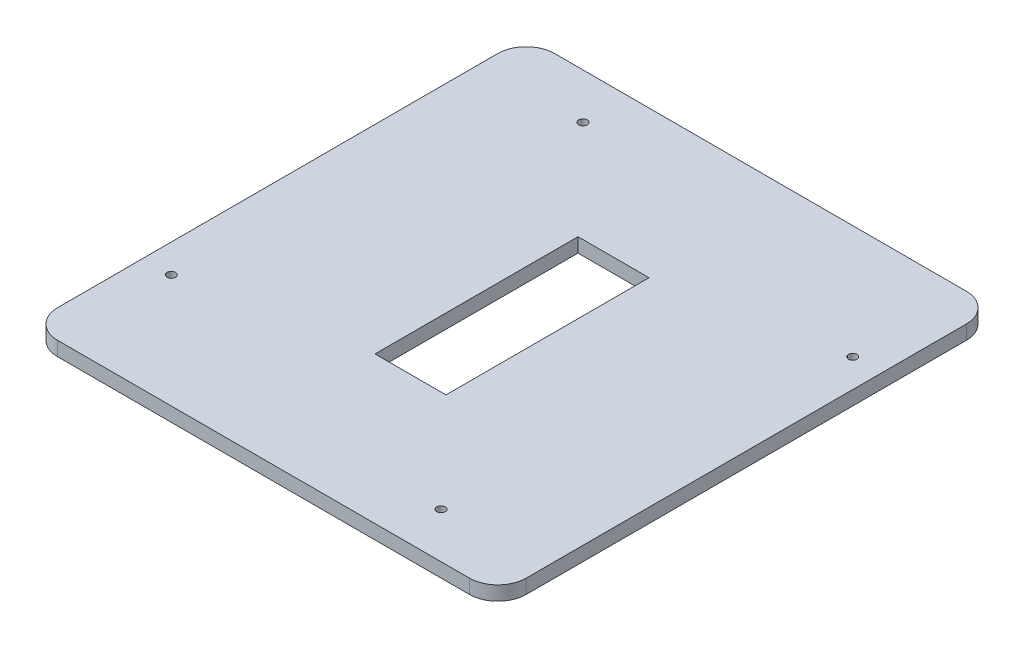
ISO-10303-21;
HEADER;
FILE_DESCRIPTION(('STEP AP214'),'2;1');
FILE_NAME('part.step','',(''),(''),'','','');
FILE_SCHEMA(('AUTOMOTIVE_DESIGN { 1 0 10303 214 1 1 1 1 }'));
ENDSEC;
DATA;
#1=APPLICATION_CONTEXT('core data for automotive mechanical design processes');
#2=APPLICATION_PROTOCOL_DEFINITION('international standard','automotive_design',2000,#1);
#3=PRODUCT_CONTEXT('',#1,'mechanical');
#4=PRODUCT('Part','Part','',(#3));
#5=PRODUCT_RELATED_PRODUCT_CATEGORY('part','',(#4));
#6=PRODUCT_DEFINITION_FORMATION('','',#4);
#7=PRODUCT_DEFINITION_CONTEXT('part definition',#1,'design');
#8=PRODUCT_DEFINITION('design','',#6,#7);
#9=PRODUCT_DEFINITION_SHAPE('','',#8);
#10=(LENGTH_UNIT() NAMED_UNIT(*) SI_UNIT(.MILLI.,.METRE.));
#11=(NAMED_UNIT(*) PLANE_ANGLE_UNIT() SI_UNIT($,.RADIAN.));
#12=(NAMED_UNIT(*) SI_UNIT($,.STERADIAN.) SOLID_ANGLE_UNIT());
#13=UNCERTAINTY_MEASURE_WITH_UNIT(LENGTH_MEASURE(1.E-05),#10,'distance_accuracy_value','');
#14=(GEOMETRIC_REPRESENTATION_CONTEXT(3) GLOBAL_UNCERTAINTY_ASSIGNED_CONTEXT((#13)) GLOBAL_UNIT_ASSIGNED_CONTEXT((#10,
#11,#12)) REPRESENTATION_CONTEXT('',''));
#15=CARTESIAN_POINT('',(0.,0.,0.));
#16=DIRECTION('',(0.,0.,1.));
#17=DIRECTION('',(1.,0.,0.));
#18=AXIS2_PLACEMENT_3D('',#15,#16,#17);
#19=CARTESIAN_POINT('',(0.,5.,-142.264378700801));
#20=DIRECTION('',(0.,0.,-1.));
#21=DIRECTION('',(-1.,0.,0.));
#22=AXIS2_PLACEMENT_3D('',#19,#20,#21);
#23=PLANE('',#22);
#24=DIRECTION('',(1.,0.,0.));
#25=VECTOR('',#24,1.);
#26=CARTESIAN_POINT('',(0.,0.,-142.264378700801));
#27=LINE('',#26,#25);
#28=CARTESIAN_POINT('',(-25.4635897407987,0.,-142.264378700801));
#29=VERTEX_POINT('',#28);
#30=CARTESIAN_POINT('',(119.536410259201,0.,-142.264378700801));
#31=VERTEX_POINT('',#30);
#32=EDGE_CURVE('E180',#29,#31,#27,.T.);
#33=ORIENTED_EDGE('',*,*,#32,.F.);
#34=DIRECTION('',(0.,-1.,0.));
#35=VECTOR('',#34,1.);
#36=CARTESIAN_POINT('',(-25.4635897407987,5.,-142.264378700801));
#37=LINE('',#36,#35);
#38=CARTESIAN_POINT('',(-25.4635897407987,5.,-142.264378700801));
#39=VERTEX_POINT('',#38);
#40=EDGE_CURVE('E11',#39,#29,#37,.T.);
#41=ORIENTED_EDGE('',*,*,#40,.F.);
#42=DIRECTION('',(1.,0.,0.));
#43=VECTOR('',#42,1.);
#44=CARTESIAN_POINT('',(0.,5.,-142.264378700801));
#45=LINE('',#44,#43);
#46=CARTESIAN_POINT('',(119.536410259201,5.,-142.264378700801));
#47=VERTEX_POINT('',#46);
#48=EDGE_CURVE('E183',#39,#47,#45,.T.);
#49=ORIENTED_EDGE('',*,*,#48,.T.);
#50=DIRECTION('',(0.,-1.,0.));
#51=VECTOR('',#50,1.);
#52=CARTESIAN_POINT('',(119.536410259201,5.,-142.264378700801));
#53=LINE('',#52,#51);
#54=EDGE_CURVE('E203',#47,#31,#53,.T.);
#55=ORIENTED_EDGE('',*,*,#54,.T.);
#56=EDGE_LOOP('',(#33,#41,#49,#55));
#57=FACE_BOUND('',#56,.T.);
#58=ADVANCED_FACE('F35',(#57),#23,.T.);
#59=CARTESIAN_POINT('',(-25.4635897407988,5.,-132.264378700801));
#60=DIRECTION('',(0.,-1.,0.));
#61=DIRECTION('',(0.,0.,-1.));
#62=AXIS2_PLACEMENT_3D('',#59,#60,#61);
#63=CYLINDRICAL_SURFACE('',#62,10.);
#64=CARTESIAN_POINT('',(-25.4635897407988,0.,-132.264378700801));
#65=DIRECTION('',(0.,1.,0.));
#66=DIRECTION('',(0.,0.,1.));
#67=AXIS2_PLACEMENT_3D('',#64,#65,#66);
#68=CIRCLE('',#67,10.);
#69=CARTESIAN_POINT('',(-35.4635897407988,0.,-132.264378700801));
#70=VERTEX_POINT('',#69);
#71=EDGE_CURVE('E206',#29,#70,#68,.T.);
#72=ORIENTED_EDGE('',*,*,#71,.T.);
#73=DIRECTION('',(0.,-1.,0.));
#74=VECTOR('',#73,1.);
#75=CARTESIAN_POINT('',(-35.4635897407988,5.,-132.264378700801));
#76=LINE('',#75,#74);
#77=CARTESIAN_POINT('',(-35.4635897407988,5.,-132.264378700801));
#78=VERTEX_POINT('',#77);
#79=EDGE_CURVE('E42',#78,#70,#76,.T.);
#80=ORIENTED_EDGE('',*,*,#79,.F.);
#81=CARTESIAN_POINT('',(-25.4635897407988,5.,-132.264378700801));
#82=DIRECTION('',(0.,1.,0.));
#83=DIRECTION('',(0.,0.,1.));
#84=AXIS2_PLACEMENT_3D('',#81,#82,#83);
#85=CIRCLE('',#84,10.);
#86=EDGE_CURVE('E186',#39,#78,#85,.T.);
#87=ORIENTED_EDGE('',*,*,#86,.F.);
#88=ORIENTED_EDGE('',*,*,#40,.T.);
#89=EDGE_LOOP('',(#72,#80,#87,#88));
#90=FACE_BOUND('',#89,.T.);
#91=ADVANCED_FACE('F265',(#90),#63,.T.);
#92=CARTESIAN_POINT('',(-35.4635897407988,5.,0.));
#93=DIRECTION('',(1.,0.,0.));
#94=DIRECTION('',(0.,0.,-1.));
#95=AXIS2_PLACEMENT_3D('',#92,#93,#94);
#96=PLANE('',#95);
#97=DIRECTION('',(0.,0.,1.));
#98=VECTOR('',#97,1.);
#99=CARTESIAN_POINT('',(-35.4635897407988,0.,0.));
#100=LINE('',#99,#98);
#101=CARTESIAN_POINT('',(-35.4635897407988,0.,22.7356212991988));
#102=VERTEX_POINT('',#101);
#103=EDGE_CURVE('E208',#70,#102,#100,.T.);
#104=ORIENTED_EDGE('',*,*,#103,.T.);
#105=DIRECTION('',(0.,-1.,0.));
#106=VECTOR('',#105,1.);
#107=CARTESIAN_POINT('',(-35.4635897407988,5.,22.7356212991988));
#108=LINE('',#107,#106);
#109=CARTESIAN_POINT('',(-35.4635897407988,5.,22.7356212991988));
#110=VERTEX_POINT('',#109);
#111=EDGE_CURVE('E233',#110,#102,#108,.T.);
#112=ORIENTED_EDGE('',*,*,#111,.F.);
#113=DIRECTION('',(0.,0.,1.));
#114=VECTOR('',#113,1.);
#115=CARTESIAN_POINT('',(-35.4635897407988,5.,0.));
#116=LINE('',#115,#114);
#117=EDGE_CURVE('E189',#78,#110,#116,.T.);
#118=ORIENTED_EDGE('',*,*,#117,.F.);
#119=ORIENTED_EDGE('',*,*,#79,.T.);
#120=EDGE_LOOP('',(#104,#112,#118,#119));
#121=FACE_BOUND('',#120,.T.);
#122=ADVANCED_FACE('F240',(#121),#96,.F.);
#123=CARTESIAN_POINT('',(-25.4635897407988,5.,22.7356212991989));
#124=DIRECTION('',(0.,-1.,0.));
#125=DIRECTION('',(0.,0.,-1.));
#126=AXIS2_PLACEMENT_3D('',#123,#124,#125);
#127=CYLINDRICAL_SURFACE('',#126,10.);
#128=CARTESIAN_POINT('',(-25.4635897407988,0.,22.7356212991989));
#129=DIRECTION('',(0.,1.,0.));
#130=DIRECTION('',(0.,0.,1.));
#131=AXIS2_PLACEMENT_3D('',#128,#129,#130);
#132=CIRCLE('',#131,10.);
#133=CARTESIAN_POINT('',(-25.4635897407987,0.,32.7356212991989));
#134=VERTEX_POINT('',#133);
#135=EDGE_CURVE('E210',#102,#134,#132,.T.);
#136=ORIENTED_EDGE('',*,*,#135,.T.);
#137=DIRECTION('',(0.,-1.,0.));
#138=VECTOR('',#137,1.);
#139=CARTESIAN_POINT('',(-25.4635897407987,5.,32.7356212991989));
#140=LINE('',#139,#138);
#141=CARTESIAN_POINT('',(-25.4635897407987,5.,32.7356212991989));
#142=VERTEX_POINT('',#141);
#143=EDGE_CURVE('E230',#142,#134,#140,.T.);
#144=ORIENTED_EDGE('',*,*,#143,.F.);
#145=CARTESIAN_POINT('',(-25.4635897407988,5.,22.7356212991989));
#146=DIRECTION('',(0.,1.,0.));
#147=DIRECTION('',(0.,0.,1.));
#148=AXIS2_PLACEMENT_3D('',#145,#146,#147);
#149=CIRCLE('',#148,10.);
#150=EDGE_CURVE('E191',#110,#142,#149,.T.);
#151=ORIENTED_EDGE('',*,*,#150,.F.);
#152=ORIENTED_EDGE('',*,*,#111,.T.);
#153=EDGE_LOOP('',(#136,#144,#151,#152));
#154=FACE_BOUND('',#153,.T.);
#155=ADVANCED_FACE('F252',(#154),#127,.T.);
#156=CARTESIAN_POINT('',(0.,5.,32.7356212991989));
#157=DIRECTION('',(0.,0.,-1.));
#158=DIRECTION('',(-1.,0.,0.));
#159=AXIS2_PLACEMENT_3D('',#156,#157,#158);
#160=PLANE('',#159);
#161=DIRECTION('',(1.,0.,0.));
#162=VECTOR('',#161,1.);
#163=CARTESIAN_POINT('',(0.,0.,32.7356212991989));
#164=LINE('',#163,#162);
#165=CARTESIAN_POINT('',(119.536410259201,0.,32.7356212991989));
#166=VERTEX_POINT('',#165);
#167=EDGE_CURVE('E212',#134,#166,#164,.T.);
#168=ORIENTED_EDGE('',*,*,#167,.T.);
#169=DIRECTION('',(0.,-1.,0.));
#170=VECTOR('',#169,1.);
#171=CARTESIAN_POINT('',(119.536410259201,5.,32.7356212991989));
#172=LINE('',#171,#170);
#173=CARTESIAN_POINT('',(119.536410259201,5.,32.7356212991989));
#174=VERTEX_POINT('',#173);
#175=EDGE_CURVE('E227',#174,#166,#172,.T.);
#176=ORIENTED_EDGE('',*,*,#175,.F.);
#177=DIRECTION('',(1.,0.,0.));
#178=VECTOR('',#177,1.);
#179=CARTESIAN_POINT('',(0.,5.,32.7356212991989));
#180=LINE('',#179,#178);
#181=EDGE_CURVE('E193',#142,#174,#180,.T.);
#182=ORIENTED_EDGE('',*,*,#181,.F.);
#183=ORIENTED_EDGE('',*,*,#143,.T.);
#184=EDGE_LOOP('',(#168,#176,#182,#183));
#185=FACE_BOUND('',#184,.T.);
#186=ADVANCED_FACE('F256',(#185),#160,.F.);
#187=CARTESIAN_POINT('',(119.536410259201,5.,22.7356212991989));
#188=DIRECTION('',(0.,-1.,0.));
#189=DIRECTION('',(0.,0.,-1.));
#190=AXIS2_PLACEMENT_3D('',#187,#188,#189);
#191=CYLINDRICAL_SURFACE('',#190,10.);
#192=CARTESIAN_POINT('',(119.536410259201,0.,22.7356212991989));
#193=DIRECTION('',(0.,1.,0.));
#194=DIRECTION('',(0.,0.,1.));
#195=AXIS2_PLACEMENT_3D('',#192,#193,#194);
#196=CIRCLE('',#195,10.);
#197=CARTESIAN_POINT('',(129.536410259201,0.,22.7356212991988));
#198=VERTEX_POINT('',#197);
#199=EDGE_CURVE('E214',#166,#198,#196,.T.);
#200=ORIENTED_EDGE('',*,*,#199,.T.);
#201=DIRECTION('',(0.,-1.,0.));
#202=VECTOR('',#201,1.);
#203=CARTESIAN_POINT('',(129.536410259201,5.,22.7356212991988));
#204=LINE('',#203,#202);
#205=CARTESIAN_POINT('',(129.536410259201,5.,22.7356212991988));
#206=VERTEX_POINT('',#205);
#207=EDGE_CURVE('E225',#206,#198,#204,.T.);
#208=ORIENTED_EDGE('',*,*,#207,.F.);
#209=CARTESIAN_POINT('',(119.536410259201,5.,22.7356212991989));
#210=DIRECTION('',(0.,1.,0.));
#211=DIRECTION('',(0.,0.,1.));
#212=AXIS2_PLACEMENT_3D('',#209,#210,#211);
#213=CIRCLE('',#212,10.);
#214=EDGE_CURVE('E195',#174,#206,#213,.T.);
#215=ORIENTED_EDGE('',*,*,#214,.F.);
#216=ORIENTED_EDGE('',*,*,#175,.T.);
#217=EDGE_LOOP('',(#200,#208,#215,#216));
#218=FACE_BOUND('',#217,.T.);
#219=ADVANCED_FACE('F274',(#218),#191,.T.);
#220=CARTESIAN_POINT('',(129.536410259201,5.,0.));
#221=DIRECTION('',(1.,0.,0.));
#222=DIRECTION('',(0.,0.,-1.));
#223=AXIS2_PLACEMENT_3D('',#220,#221,#222);
#224=PLANE('',#223);
#225=DIRECTION('',(0.,0.,1.));
#226=VECTOR('',#225,1.);
#227=CARTESIAN_POINT('',(129.536410259201,0.,0.));
#228=LINE('',#227,#226);
#229=CARTESIAN_POINT('',(129.536410259201,0.,-132.264378700801));
#230=VERTEX_POINT('',#229);
#231=EDGE_CURVE('E217',#230,#198,#228,.T.);
#232=ORIENTED_EDGE('',*,*,#231,.F.);
#233=DIRECTION('',(0.,-1.,0.));
#234=VECTOR('',#233,1.);
#235=CARTESIAN_POINT('',(129.536410259201,5.,-132.264378700801));
#236=LINE('',#235,#234);
#237=CARTESIAN_POINT('',(129.536410259201,5.,-132.264378700801));
#238=VERTEX_POINT('',#237);
#239=EDGE_CURVE('E223',#238,#230,#236,.T.);
#240=ORIENTED_EDGE('',*,*,#239,.F.);
#241=DIRECTION('',(0.,0.,1.));
#242=VECTOR('',#241,1.);
#243=CARTESIAN_POINT('',(129.536410259201,5.,0.));
#244=LINE('',#243,#242);
#245=EDGE_CURVE('E197',#238,#206,#244,.T.);
#246=ORIENTED_EDGE('',*,*,#245,.T.);
#247=ORIENTED_EDGE('',*,*,#207,.T.);
#248=EDGE_LOOP('',(#232,#240,#246,#247));
#249=FACE_BOUND('',#248,.T.);
#250=ADVANCED_FACE('F272',(#249),#224,.T.);
#251=CARTESIAN_POINT('',(119.536410259201,5.,-132.264378700801));
#252=DIRECTION('',(0.,-1.,0.));
#253=DIRECTION('',(0.,0.,-1.));
#254=AXIS2_PLACEMENT_3D('',#251,#252,#253);
#255=CYLINDRICAL_SURFACE('',#254,10.);
#256=CARTESIAN_POINT('',(119.536410259201,0.,-132.264378700801));
#257=DIRECTION('',(0.,1.,0.));
#258=DIRECTION('',(0.,0.,1.));
#259=AXIS2_PLACEMENT_3D('',#256,#257,#258);
#260=CIRCLE('',#259,10.);
#261=EDGE_CURVE('E187',#31,#230,#260,.F.);
#262=ORIENTED_EDGE('',*,*,#261,.F.);
#263=ORIENTED_EDGE('',*,*,#54,.F.);
#264=CARTESIAN_POINT('',(119.536410259201,5.,-132.264378700801));
#265=DIRECTION('',(0.,1.,0.));
#266=DIRECTION('',(0.,0.,1.));
#267=AXIS2_PLACEMENT_3D('',#264,#265,#266);
#268=CIRCLE('',#267,10.);
#269=EDGE_CURVE('E200',#47,#238,#268,.F.);
#270=ORIENTED_EDGE('',*,*,#269,.T.);
#271=ORIENTED_EDGE('',*,*,#239,.T.);
#272=EDGE_LOOP('',(#262,#263,#270,#271));
#273=FACE_BOUND('',#272,.T.);
#274=ADVANCED_FACE('F269',(#273),#255,.T.);
#275=CARTESIAN_POINT('',(0.,5.,0.));
#276=DIRECTION('',(0.,1.,0.));
#277=DIRECTION('',(0.,0.,1.));
#278=AXIS2_PLACEMENT_3D('',#275,#276,#277);
#279=PLANE('',#278);
#280=DIRECTION('',(0.,0.,1.));
#281=VECTOR('',#280,1.);
#282=CARTESIAN_POINT('',(34.5364102592012,5.,-90.5143787008011));
#283=LINE('',#282,#281);
#284=CARTESIAN_POINT('',(34.5364102592012,5.,-90.5143787008011));
#285=VERTEX_POINT('',#284);
#286=CARTESIAN_POINT('',(34.5364102592012,5.,-19.0143787008011));
#287=VERTEX_POINT('',#286);
#288=EDGE_CURVE('E49',#285,#287,#283,.T.);
#289=ORIENTED_EDGE('',*,*,#288,.F.);
#290=DIRECTION('',(-1.,0.,0.));
#291=VECTOR('',#290,1.);
#292=CARTESIAN_POINT('',(34.5364102592012,5.,-90.5143787008011));
#293=LINE('',#292,#291);
#294=CARTESIAN_POINT('',(59.5364102592012,5.,-90.5143787008011));
#295=VERTEX_POINT('',#294);
#296=EDGE_CURVE('E140',#295,#285,#293,.T.);
#297=ORIENTED_EDGE('',*,*,#296,.F.);
#298=DIRECTION('',(0.,0.,-1.));
#299=VECTOR('',#298,1.);
#300=CARTESIAN_POINT('',(59.5364102592012,5.,-90.5143787008011));
#301=LINE('',#300,#299);
#302=CARTESIAN_POINT('',(59.5364102592012,5.,-19.0143787008011));
#303=VERTEX_POINT('',#302);
#304=EDGE_CURVE('E143',#303,#295,#301,.T.);
#305=ORIENTED_EDGE('',*,*,#304,.F.);
#306=DIRECTION('',(1.,0.,0.));
#307=VECTOR('',#306,1.);
#308=CARTESIAN_POINT('',(34.5364102592012,5.,-19.0143787008011));
#309=LINE('',#308,#307);
#310=EDGE_CURVE('E149',#287,#303,#309,.T.);
#311=ORIENTED_EDGE('',*,*,#310,.F.);
#312=EDGE_LOOP('',(#289,#297,#305,#311));
#313=FACE_BOUND('',#312,.T.);
#314=CARTESIAN_POINT('',(0.53641025920121,5.,-126.264378700801));
#315=DIRECTION('',(0.,1.,0.));
#316=DIRECTION('',(0.,0.,1.));
#317=AXIS2_PLACEMENT_3D('',#314,#315,#316);
#318=CIRCLE('',#317,1.5);
#319=CARTESIAN_POINT('',(0.53641025920121,5.,-124.764378700801));
#320=VERTEX_POINT('',#319);
#321=EDGE_CURVE('E163',#320,#320,#318,.T.);
#322=ORIENTED_EDGE('',*,*,#321,.F.);
#323=EDGE_LOOP('',(#322));
#324=FACE_BOUND('',#323,.T.);
#325=CARTESIAN_POINT('',(119.536410259201,5.,-102.264378700801));
#326=DIRECTION('',(0.,1.,0.));
#327=DIRECTION('',(0.,0.,1.));
#328=AXIS2_PLACEMENT_3D('',#325,#326,#327);
#329=CIRCLE('',#328,1.5);
#330=CARTESIAN_POINT('',(119.536410259201,5.,-100.764378700801));
#331=VERTEX_POINT('',#330);
#332=EDGE_CURVE('E169',#331,#331,#329,.T.);
#333=ORIENTED_EDGE('',*,*,#332,.F.);
#334=EDGE_LOOP('',(#333));
#335=FACE_BOUND('',#334,.T.);
#336=CARTESIAN_POINT('',(93.5364102592012,5.,16.7356212991989));
#337=DIRECTION('',(0.,1.,0.));
#338=DIRECTION('',(0.,0.,1.));
#339=AXIS2_PLACEMENT_3D('',#336,#337,#338);
#340=CIRCLE('',#339,1.5);
#341=CARTESIAN_POINT('',(93.5364102592012,5.,18.2356212991989));
#342=VERTEX_POINT('',#341);
#343=EDGE_CURVE('E155',#342,#342,#340,.T.);
#344=ORIENTED_EDGE('',*,*,#343,.F.);
#345=EDGE_LOOP('',(#344));
#346=FACE_BOUND('',#345,.T.);
#347=CARTESIAN_POINT('',(-25.4635897407988,5.,-7.2643787008011));
#348=DIRECTION('',(0.,1.,0.));
#349=DIRECTION('',(0.,0.,1.));
#350=AXIS2_PLACEMENT_3D('',#347,#348,#349);
#351=CIRCLE('',#350,1.5);
#352=CARTESIAN_POINT('',(-25.4635897407988,5.,-5.7643787008011));
#353=VERTEX_POINT('',#352);
#354=EDGE_CURVE('E162',#353,#353,#351,.T.);
#355=ORIENTED_EDGE('',*,*,#354,.F.);
#356=EDGE_LOOP('',(#355));
#357=FACE_BOUND('',#356,.T.);
#358=ORIENTED_EDGE('',*,*,#48,.F.);
#359=ORIENTED_EDGE('',*,*,#86,.T.);
#360=ORIENTED_EDGE('',*,*,#117,.T.);
#361=ORIENTED_EDGE('',*,*,#150,.T.);
#362=ORIENTED_EDGE('',*,*,#181,.T.);
#363=ORIENTED_EDGE('',*,*,#214,.T.);
#364=ORIENTED_EDGE('',*,*,#245,.F.);
#365=ORIENTED_EDGE('',*,*,#269,.F.);
#366=EDGE_LOOP('',(#358,#359,#360,#361,#362,#363,#364,#365));
#367=FACE_BOUND('',#366,.T.);
#368=ADVANCED_FACE('F261',(#313,#324,#335,#346,#357,#367),#279,.T.);
#369=CARTESIAN_POINT('',(0.,0.,0.));
#370=DIRECTION('',(0.,1.,0.));
#371=DIRECTION('',(0.,0.,1.));
#372=AXIS2_PLACEMENT_3D('',#369,#370,#371);
#373=PLANE('',#372);
#374=DIRECTION('',(-1.,0.,0.));
#375=VECTOR('',#374,1.);
#376=CARTESIAN_POINT('',(34.5364102592012,0.,-90.5143787008011));
#377=LINE('',#376,#375);
#378=CARTESIAN_POINT('',(59.5364102592012,0.,-90.5143787008011));
#379=VERTEX_POINT('',#378);
#380=CARTESIAN_POINT('',(34.5364102592012,0.,-90.5143787008011));
#381=VERTEX_POINT('',#380);
#382=EDGE_CURVE('E130',#379,#381,#377,.T.);
#383=ORIENTED_EDGE('',*,*,#382,.T.);
#384=DIRECTION('',(0.,0.,1.));
#385=VECTOR('',#384,1.);
#386=CARTESIAN_POINT('',(34.5364102592012,0.,-90.5143787008011));
#387=LINE('',#386,#385);
#388=CARTESIAN_POINT('',(34.5364102592012,0.,-19.0143787008011));
#389=VERTEX_POINT('',#388);
#390=EDGE_CURVE('E124',#381,#389,#387,.T.);
#391=ORIENTED_EDGE('',*,*,#390,.T.);
#392=DIRECTION('',(1.,0.,0.));
#393=VECTOR('',#392,1.);
#394=CARTESIAN_POINT('',(34.5364102592012,0.,-19.0143787008011));
#395=LINE('',#394,#393);
#396=CARTESIAN_POINT('',(59.5364102592012,0.,-19.0143787008011));
#397=VERTEX_POINT('',#396);
#398=EDGE_CURVE('E133',#389,#397,#395,.T.);
#399=ORIENTED_EDGE('',*,*,#398,.T.);
#400=DIRECTION('',(0.,0.,-1.));
#401=VECTOR('',#400,1.);
#402=CARTESIAN_POINT('',(59.5364102592012,0.,-90.5143787008011));
#403=LINE('',#402,#401);
#404=EDGE_CURVE('E57',#397,#379,#403,.T.);
#405=ORIENTED_EDGE('',*,*,#404,.T.);
#406=EDGE_LOOP('',(#383,#391,#399,#405));
#407=FACE_BOUND('',#406,.T.);
#408=CARTESIAN_POINT('',(0.53641025920121,0.,-126.264378700801));
#409=DIRECTION('',(0.,1.,0.));
#410=DIRECTION('',(0.,0.,1.));
#411=AXIS2_PLACEMENT_3D('',#408,#409,#410);
#412=CIRCLE('',#411,1.5);
#413=CARTESIAN_POINT('',(0.53641025920121,0.,-124.764378700801));
#414=VERTEX_POINT('',#413);
#415=EDGE_CURVE('E159',#414,#414,#412,.T.);
#416=ORIENTED_EDGE('',*,*,#415,.T.);
#417=EDGE_LOOP('',(#416));
#418=FACE_BOUND('',#417,.T.);
#419=CARTESIAN_POINT('',(119.536410259201,0.,-102.264378700801));
#420=DIRECTION('',(0.,1.,0.));
#421=DIRECTION('',(0.,0.,1.));
#422=AXIS2_PLACEMENT_3D('',#419,#420,#421);
#423=CIRCLE('',#422,1.5);
#424=CARTESIAN_POINT('',(119.536410259201,0.,-100.764378700801));
#425=VERTEX_POINT('',#424);
#426=EDGE_CURVE('E166',#425,#425,#423,.T.);
#427=ORIENTED_EDGE('',*,*,#426,.T.);
#428=EDGE_LOOP('',(#427));
#429=FACE_BOUND('',#428,.T.);
#430=CARTESIAN_POINT('',(93.5364102592012,0.,16.7356212991989));
#431=DIRECTION('',(0.,1.,0.));
#432=DIRECTION('',(0.,0.,1.));
#433=AXIS2_PLACEMENT_3D('',#430,#431,#432);
#434=CIRCLE('',#433,1.5);
#435=CARTESIAN_POINT('',(93.5364102592012,0.,18.2356212991989));
#436=VERTEX_POINT('',#435);
#437=EDGE_CURVE('E172',#436,#436,#434,.T.);
#438=ORIENTED_EDGE('',*,*,#437,.T.);
#439=EDGE_LOOP('',(#438));
#440=FACE_BOUND('',#439,.T.);
#441=CARTESIAN_POINT('',(-25.4635897407988,0.,-7.2643787008011));
#442=DIRECTION('',(0.,1.,0.));
#443=DIRECTION('',(0.,0.,1.));
#444=AXIS2_PLACEMENT_3D('',#441,#442,#443);
#445=CIRCLE('',#444,1.5);
#446=CARTESIAN_POINT('',(-25.4635897407988,0.,-5.7643787008011));
#447=VERTEX_POINT('',#446);
#448=EDGE_CURVE('E177',#447,#447,#445,.T.);
#449=ORIENTED_EDGE('',*,*,#448,.T.);
#450=EDGE_LOOP('',(#449));
#451=FACE_BOUND('',#450,.T.);
#452=ORIENTED_EDGE('',*,*,#32,.T.);
#453=ORIENTED_EDGE('',*,*,#261,.T.);
#454=ORIENTED_EDGE('',*,*,#231,.T.);
#455=ORIENTED_EDGE('',*,*,#199,.F.);
#456=ORIENTED_EDGE('',*,*,#167,.F.);
#457=ORIENTED_EDGE('',*,*,#135,.F.);
#458=ORIENTED_EDGE('',*,*,#103,.F.);
#459=ORIENTED_EDGE('',*,*,#71,.F.);
#460=EDGE_LOOP('',(#452,#453,#454,#455,#456,#457,#458,#459));
#461=FACE_BOUND('',#460,.T.);
#462=ADVANCED_FACE('F137',(#407,#418,#429,#440,#451,#461),#373,.F.);
#463=CARTESIAN_POINT('',(-25.4635897407988,0.,-7.2643787008011));
#464=DIRECTION('',(0.,1.,0.));
#465=DIRECTION('',(0.,0.,1.));
#466=AXIS2_PLACEMENT_3D('',#463,#464,#465);
#467=CYLINDRICAL_SURFACE('',#466,1.5);
#468=ORIENTED_EDGE('',*,*,#448,.F.);
#469=EDGE_LOOP('',(#468));
#470=FACE_BOUND('',#469,.T.);
#471=ORIENTED_EDGE('',*,*,#354,.T.);
#472=EDGE_LOOP('',(#471));
#473=FACE_BOUND('',#472,.T.);
#474=ADVANCED_FACE('F327',(#470,#473),#467,.F.);
#475=CARTESIAN_POINT('',(93.5364102592012,0.,16.7356212991989));
#476=DIRECTION('',(0.,1.,0.));
#477=DIRECTION('',(0.,0.,1.));
#478=AXIS2_PLACEMENT_3D('',#475,#476,#477);
#479=CYLINDRICAL_SURFACE('',#478,1.5);
#480=ORIENTED_EDGE('',*,*,#437,.F.);
#481=EDGE_LOOP('',(#480));
#482=FACE_BOUND('',#481,.T.);
#483=ORIENTED_EDGE('',*,*,#343,.T.);
#484=EDGE_LOOP('',(#483));
#485=FACE_BOUND('',#484,.T.);
#486=ADVANCED_FACE('F332',(#482,#485),#479,.F.);
#487=CARTESIAN_POINT('',(119.536410259201,0.,-102.264378700801));
#488=DIRECTION('',(0.,1.,0.));
#489=DIRECTION('',(0.,0.,1.));
#490=AXIS2_PLACEMENT_3D('',#487,#488,#489);
#491=CYLINDRICAL_SURFACE('',#490,1.5);
#492=ORIENTED_EDGE('',*,*,#426,.F.);
#493=EDGE_LOOP('',(#492));
#494=FACE_BOUND('',#493,.T.);
#495=ORIENTED_EDGE('',*,*,#332,.T.);
#496=EDGE_LOOP('',(#495));
#497=FACE_BOUND('',#496,.T.);
#498=ADVANCED_FACE('F344',(#494,#497),#491,.F.);
#499=CARTESIAN_POINT('',(0.53641025920121,0.,-126.264378700801));
#500=DIRECTION('',(0.,1.,0.));
#501=DIRECTION('',(0.,0.,1.));
#502=AXIS2_PLACEMENT_3D('',#499,#500,#501);
#503=CYLINDRICAL_SURFACE('',#502,1.5);
#504=ORIENTED_EDGE('',*,*,#415,.F.);
#505=EDGE_LOOP('',(#504));
#506=FACE_BOUND('',#505,.T.);
#507=ORIENTED_EDGE('',*,*,#321,.T.);
#508=EDGE_LOOP('',(#507));
#509=FACE_BOUND('',#508,.T.);
#510=ADVANCED_FACE('F354',(#506,#509),#503,.F.);
#511=CARTESIAN_POINT('',(34.5364102592012,0.,-90.5143787008011));
#512=DIRECTION('',(-1.,0.,0.));
#513=DIRECTION('',(0.,0.,1.));
#514=AXIS2_PLACEMENT_3D('',#511,#512,#513);
#515=PLANE('',#514);
#516=ORIENTED_EDGE('',*,*,#288,.T.);
#517=DIRECTION('',(0.,1.,0.));
#518=VECTOR('',#517,1.);
#519=CARTESIAN_POINT('',(34.5364102592012,0.,-19.0143787008011));
#520=LINE('',#519,#518);
#521=EDGE_CURVE('E120',#389,#287,#520,.T.);
#522=ORIENTED_EDGE('',*,*,#521,.F.);
#523=ORIENTED_EDGE('',*,*,#390,.F.);
#524=DIRECTION('',(0.,1.,0.));
#525=VECTOR('',#524,1.);
#526=CARTESIAN_POINT('',(34.5364102592012,0.,-90.5143787008011));
#527=LINE('',#526,#525);
#528=EDGE_CURVE('E153',#381,#285,#527,.T.);
#529=ORIENTED_EDGE('',*,*,#528,.T.);
#530=EDGE_LOOP('',(#516,#522,#523,#529));
#531=FACE_BOUND('',#530,.T.);
#532=ADVANCED_FACE('F122',(#531),#515,.F.);
#533=CARTESIAN_POINT('',(34.5364102592012,0.,-90.5143787008011));
#534=DIRECTION('',(0.,0.,-1.));
#535=DIRECTION('',(-1.,0.,0.));
#536=AXIS2_PLACEMENT_3D('',#533,#534,#535);
#537=PLANE('',#536);
#538=ORIENTED_EDGE('',*,*,#296,.T.);
#539=ORIENTED_EDGE('',*,*,#528,.F.);
#540=ORIENTED_EDGE('',*,*,#382,.F.);
#541=DIRECTION('',(0.,1.,0.));
#542=VECTOR('',#541,1.);
#543=CARTESIAN_POINT('',(59.5364102592012,0.,-90.5143787008011));
#544=LINE('',#543,#542);
#545=EDGE_CURVE('E156',#379,#295,#544,.T.);
#546=ORIENTED_EDGE('',*,*,#545,.T.);
#547=EDGE_LOOP('',(#538,#539,#540,#546));
#548=FACE_BOUND('',#547,.T.);
#549=ADVANCED_FACE('F386',(#548),#537,.F.);
#550=CARTESIAN_POINT('',(59.5364102592012,0.,-90.5143787008011));
#551=DIRECTION('',(1.,0.,0.));
#552=DIRECTION('',(0.,0.,-1.));
#553=AXIS2_PLACEMENT_3D('',#550,#551,#552);
#554=PLANE('',#553);
#555=ORIENTED_EDGE('',*,*,#304,.T.);
#556=ORIENTED_EDGE('',*,*,#545,.F.);
#557=ORIENTED_EDGE('',*,*,#404,.F.);
#558=DIRECTION('',(0.,1.,0.));
#559=VECTOR('',#558,1.);
#560=CARTESIAN_POINT('',(59.5364102592012,0.,-19.0143787008011));
#561=LINE('',#560,#559);
#562=EDGE_CURVE('E129',#397,#303,#561,.T.);
#563=ORIENTED_EDGE('',*,*,#562,.T.);
#564=EDGE_LOOP('',(#555,#556,#557,#563));
#565=FACE_BOUND('',#564,.T.);
#566=ADVANCED_FACE('F395',(#565),#554,.F.);
#567=CARTESIAN_POINT('',(34.5364102592012,0.,-19.0143787008011));
#568=DIRECTION('',(0.,0.,1.));
#569=DIRECTION('',(1.,0.,0.));
#570=AXIS2_PLACEMENT_3D('',#567,#568,#569);
#571=PLANE('',#570);
#572=ORIENTED_EDGE('',*,*,#310,.T.);
#573=ORIENTED_EDGE('',*,*,#562,.F.);
#574=ORIENTED_EDGE('',*,*,#398,.F.);
#575=ORIENTED_EDGE('',*,*,#521,.T.);
#576=EDGE_LOOP('',(#572,#573,#574,#575));
#577=FACE_BOUND('',#576,.T.);
#578=ADVANCED_FACE('F134',(#577),#571,.F.);
#579=CLOSED_SHELL('',(#58,#91,#122,#155,#186,#219,#250,#274,#368,#462,#474,#486,#498,#510,#532,
#549,#566,#578));
#580=MANIFOLD_SOLID_BREP('B2',#579);
#581=ADVANCED_BREP_SHAPE_REPRESENTATION('',(#18,#580),#14);
#582=SHAPE_DEFINITION_REPRESENTATION(#9,#581);
ENDSEC;
END-ISO-10303-21;
